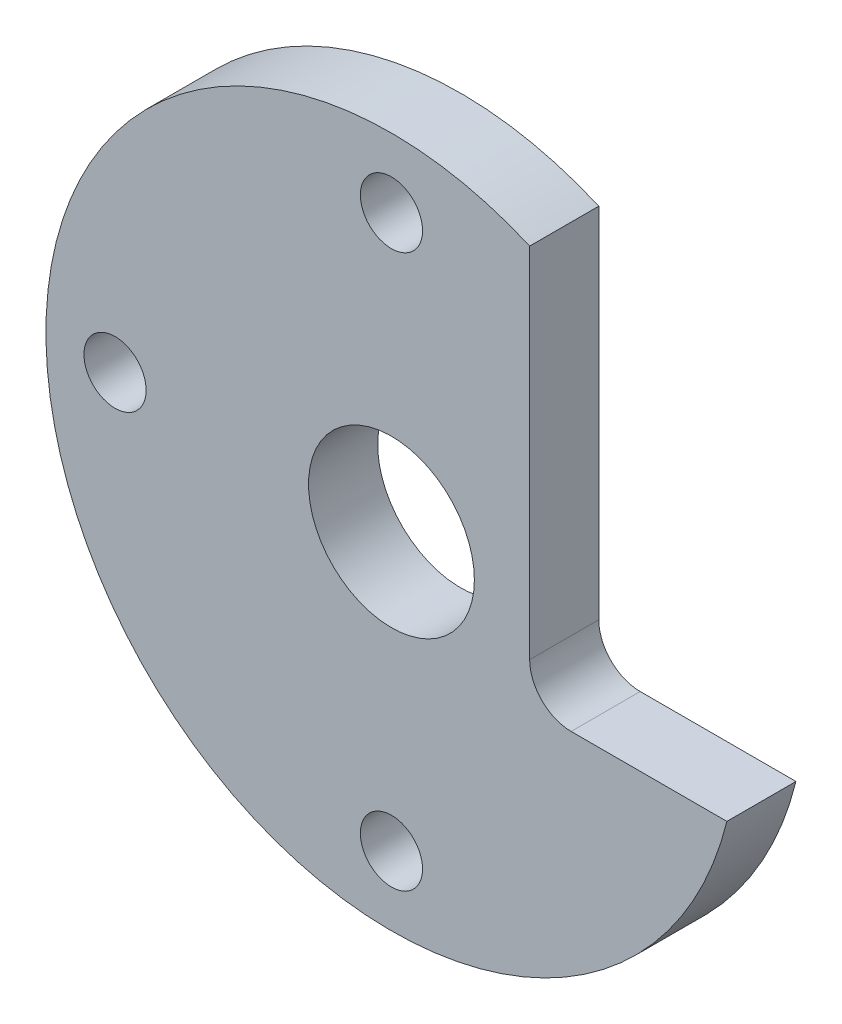
ISO-10303-21;
HEADER;
FILE_DESCRIPTION(('STEP AP214'),'2;1');
FILE_NAME('part.step','',(''),(''),'','','');
FILE_SCHEMA(('AUTOMOTIVE_DESIGN { 1 0 10303 214 1 1 1 1 }'));
ENDSEC;
DATA;
#1=APPLICATION_CONTEXT('core data for automotive mechanical design processes');
#2=APPLICATION_PROTOCOL_DEFINITION('international standard','automotive_design',2000,#1);
#3=PRODUCT_CONTEXT('',#1,'mechanical');
#4=PRODUCT('Part','Part','',(#3));
#5=PRODUCT_RELATED_PRODUCT_CATEGORY('part','',(#4));
#6=PRODUCT_DEFINITION_FORMATION('','',#4);
#7=PRODUCT_DEFINITION_CONTEXT('part definition',#1,'design');
#8=PRODUCT_DEFINITION('design','',#6,#7);
#9=PRODUCT_DEFINITION_SHAPE('','',#8);
#10=(LENGTH_UNIT() NAMED_UNIT(*) SI_UNIT(.MILLI.,.METRE.));
#11=(NAMED_UNIT(*) PLANE_ANGLE_UNIT() SI_UNIT($,.RADIAN.));
#12=(NAMED_UNIT(*) SI_UNIT($,.STERADIAN.) SOLID_ANGLE_UNIT());
#13=UNCERTAINTY_MEASURE_WITH_UNIT(LENGTH_MEASURE(1.E-05),#10,'distance_accuracy_value','');
#14=(GEOMETRIC_REPRESENTATION_CONTEXT(3) GLOBAL_UNCERTAINTY_ASSIGNED_CONTEXT((#13)) GLOBAL_UNIT_ASSIGNED_CONTEXT((#10,
#11,#12)) REPRESENTATION_CONTEXT('',''));
#15=CARTESIAN_POINT('',(0.,0.,0.));
#16=DIRECTION('',(0.,0.,1.));
#17=DIRECTION('',(1.,0.,0.));
#18=AXIS2_PLACEMENT_3D('',#15,#16,#17);
#19=CARTESIAN_POINT('',(0.,0.,5.));
#20=DIRECTION('',(0.,0.,1.));
#21=DIRECTION('',(1.,0.,0.));
#22=AXIS2_PLACEMENT_3D('',#19,#20,#21);
#23=PLANE('',#22);
#24=DIRECTION('',(-1.,0.,0.));
#25=VECTOR('',#24,1.);
#26=CARTESIAN_POINT('',(10.,-6.,5.));
#27=LINE('',#26,#25);
#28=CARTESIAN_POINT('',(24.2693221990232,-6.,5.));
#29=VERTEX_POINT('',#28);
#30=CARTESIAN_POINT('',(13.,-6.,5.));
#31=VERTEX_POINT('',#30);
#32=EDGE_CURVE('E75',#29,#31,#27,.T.);
#33=ORIENTED_EDGE('',*,*,#32,.T.);
#34=CARTESIAN_POINT('',(13.,-3.,5.));
#35=DIRECTION('',(0.,0.,1.));
#36=DIRECTION('',(1.,0.,0.));
#37=AXIS2_PLACEMENT_3D('',#34,#35,#36);
#38=CIRCLE('',#37,3.);
#39=CARTESIAN_POINT('',(10.,-3.,5.));
#40=VERTEX_POINT('',#39);
#41=EDGE_CURVE('E11',#31,#40,#38,.F.);
#42=ORIENTED_EDGE('',*,*,#41,.T.);
#43=DIRECTION('',(0.,1.,0.));
#44=VECTOR('',#43,1.);
#45=CARTESIAN_POINT('',(10.,33.3511979168591,5.));
#46=LINE('',#45,#44);
#47=CARTESIAN_POINT('',(10.,22.9128784747792,5.));
#48=VERTEX_POINT('',#47);
#49=EDGE_CURVE('E108',#40,#48,#46,.T.);
#50=ORIENTED_EDGE('',*,*,#49,.T.);
#51=CARTESIAN_POINT('',(0.,0.,5.));
#52=DIRECTION('',(0.,0.,1.));
#53=DIRECTION('',(1.,0.,0.));
#54=AXIS2_PLACEMENT_3D('',#51,#52,#53);
#55=CIRCLE('',#54,25.);
#56=EDGE_CURVE('E81',#48,#29,#55,.T.);
#57=ORIENTED_EDGE('',*,*,#56,.T.);
#58=EDGE_LOOP('',(#33,#42,#50,#57));
#59=FACE_BOUND('',#58,.T.);
#60=CARTESIAN_POINT('',(-20.,0.,5.));
#61=DIRECTION('',(0.,0.,1.));
#62=DIRECTION('',(1.,0.,0.));
#63=AXIS2_PLACEMENT_3D('',#60,#61,#62);
#64=CIRCLE('',#63,2.25);
#65=CARTESIAN_POINT('',(-17.75,0.,5.));
#66=VERTEX_POINT('',#65);
#67=EDGE_CURVE('E122',#66,#66,#64,.T.);
#68=ORIENTED_EDGE('',*,*,#67,.F.);
#69=EDGE_LOOP('',(#68));
#70=FACE_BOUND('',#69,.T.);
#71=CARTESIAN_POINT('',(0.,0.,5.));
#72=DIRECTION('',(0.,0.,1.));
#73=DIRECTION('',(1.,0.,0.));
#74=AXIS2_PLACEMENT_3D('',#71,#72,#73);
#75=CIRCLE('',#74,6.);
#76=CARTESIAN_POINT('',(6.,0.,5.));
#77=VERTEX_POINT('',#76);
#78=EDGE_CURVE('E92',#77,#77,#75,.T.);
#79=ORIENTED_EDGE('',*,*,#78,.F.);
#80=EDGE_LOOP('',(#79));
#81=FACE_BOUND('',#80,.T.);
#82=CARTESIAN_POINT('',(0.,20.,5.));
#83=DIRECTION('',(0.,0.,1.));
#84=DIRECTION('',(1.,0.,0.));
#85=AXIS2_PLACEMENT_3D('',#82,#83,#84);
#86=CIRCLE('',#85,2.25);
#87=CARTESIAN_POINT('',(2.25,20.,5.));
#88=VERTEX_POINT('',#87);
#89=EDGE_CURVE('E128',#88,#88,#86,.T.);
#90=ORIENTED_EDGE('',*,*,#89,.F.);
#91=EDGE_LOOP('',(#90));
#92=FACE_BOUND('',#91,.T.);
#93=CARTESIAN_POINT('',(0.,-20.,5.));
#94=DIRECTION('',(0.,0.,1.));
#95=DIRECTION('',(1.,0.,0.));
#96=AXIS2_PLACEMENT_3D('',#93,#94,#95);
#97=CIRCLE('',#96,2.25);
#98=CARTESIAN_POINT('',(2.25,-20.,5.));
#99=VERTEX_POINT('',#98);
#100=EDGE_CURVE('E115',#99,#99,#97,.T.);
#101=ORIENTED_EDGE('',*,*,#100,.F.);
#102=EDGE_LOOP('',(#101));
#103=FACE_BOUND('',#102,.T.);
#104=ADVANCED_FACE('F34',(#59,#70,#81,#92,#103),#23,.T.);
#105=CARTESIAN_POINT('',(0.,0.,0.));
#106=DIRECTION('',(0.,0.,1.));
#107=DIRECTION('',(1.,0.,0.));
#108=AXIS2_PLACEMENT_3D('',#105,#106,#107);
#109=PLANE('',#108);
#110=CARTESIAN_POINT('',(0.,0.,0.));
#111=DIRECTION('',(0.,0.,1.));
#112=DIRECTION('',(1.,0.,0.));
#113=AXIS2_PLACEMENT_3D('',#110,#111,#112);
#114=CIRCLE('',#113,25.);
#115=CARTESIAN_POINT('',(10.,22.9128784747792,0.));
#116=VERTEX_POINT('',#115);
#117=CARTESIAN_POINT('',(24.2693221990232,-6.,0.));
#118=VERTEX_POINT('',#117);
#119=EDGE_CURVE('E86',#116,#118,#114,.T.);
#120=ORIENTED_EDGE('',*,*,#119,.F.);
#121=DIRECTION('',(0.,1.,0.));
#122=VECTOR('',#121,1.);
#123=CARTESIAN_POINT('',(10.,33.3511979168591,0.));
#124=LINE('',#123,#122);
#125=CARTESIAN_POINT('',(10.,-3.,0.));
#126=VERTEX_POINT('',#125);
#127=EDGE_CURVE('E87',#126,#116,#124,.T.);
#128=ORIENTED_EDGE('',*,*,#127,.F.);
#129=CARTESIAN_POINT('',(13.,-3.,0.));
#130=DIRECTION('',(0.,0.,1.));
#131=DIRECTION('',(1.,0.,0.));
#132=AXIS2_PLACEMENT_3D('',#129,#130,#131);
#133=CIRCLE('',#132,3.);
#134=CARTESIAN_POINT('',(13.,-6.,0.));
#135=VERTEX_POINT('',#134);
#136=EDGE_CURVE('E42',#126,#135,#133,.T.);
#137=ORIENTED_EDGE('',*,*,#136,.T.);
#138=DIRECTION('',(-1.,0.,0.));
#139=VECTOR('',#138,1.);
#140=CARTESIAN_POINT('',(10.,-6.,0.));
#141=LINE('',#140,#139);
#142=EDGE_CURVE('E74',#118,#135,#141,.T.);
#143=ORIENTED_EDGE('',*,*,#142,.F.);
#144=EDGE_LOOP('',(#120,#128,#137,#143));
#145=FACE_BOUND('',#144,.T.);
#146=CARTESIAN_POINT('',(0.,0.,0.));
#147=DIRECTION('',(0.,0.,1.));
#148=DIRECTION('',(1.,0.,0.));
#149=AXIS2_PLACEMENT_3D('',#146,#147,#148);
#150=CIRCLE('',#149,6.);
#151=CARTESIAN_POINT('',(6.,0.,0.));
#152=VERTEX_POINT('',#151);
#153=EDGE_CURVE('E96',#152,#152,#150,.T.);
#154=ORIENTED_EDGE('',*,*,#153,.T.);
#155=EDGE_LOOP('',(#154));
#156=FACE_BOUND('',#155,.T.);
#157=CARTESIAN_POINT('',(0.,20.,0.));
#158=DIRECTION('',(0.,0.,1.));
#159=DIRECTION('',(1.,0.,0.));
#160=AXIS2_PLACEMENT_3D('',#157,#158,#159);
#161=CIRCLE('',#160,2.25);
#162=CARTESIAN_POINT('',(2.25,20.,0.));
#163=VERTEX_POINT('',#162);
#164=EDGE_CURVE('E125',#163,#163,#161,.T.);
#165=ORIENTED_EDGE('',*,*,#164,.T.);
#166=EDGE_LOOP('',(#165));
#167=FACE_BOUND('',#166,.T.);
#168=CARTESIAN_POINT('',(-20.,0.,0.));
#169=DIRECTION('',(0.,0.,1.));
#170=DIRECTION('',(1.,0.,0.));
#171=AXIS2_PLACEMENT_3D('',#168,#169,#170);
#172=CIRCLE('',#171,2.25);
#173=CARTESIAN_POINT('',(-17.75,0.,0.));
#174=VERTEX_POINT('',#173);
#175=EDGE_CURVE('E118',#174,#174,#172,.T.);
#176=ORIENTED_EDGE('',*,*,#175,.T.);
#177=EDGE_LOOP('',(#176));
#178=FACE_BOUND('',#177,.T.);
#179=CARTESIAN_POINT('',(0.,-20.,0.));
#180=DIRECTION('',(0.,0.,1.));
#181=DIRECTION('',(1.,0.,0.));
#182=AXIS2_PLACEMENT_3D('',#179,#180,#181);
#183=CIRCLE('',#182,2.25);
#184=CARTESIAN_POINT('',(2.25,-20.,0.));
#185=VERTEX_POINT('',#184);
#186=EDGE_CURVE('E119',#185,#185,#183,.T.);
#187=ORIENTED_EDGE('',*,*,#186,.T.);
#188=EDGE_LOOP('',(#187));
#189=FACE_BOUND('',#188,.T.);
#190=ADVANCED_FACE('F84',(#145,#156,#167,#178,#189),#109,.F.);
#191=CARTESIAN_POINT('',(0.,0.,5.));
#192=DIRECTION('',(0.,0.,-1.));
#193=DIRECTION('',(-1.,0.,0.));
#194=AXIS2_PLACEMENT_3D('',#191,#192,#193);
#195=CYLINDRICAL_SURFACE('',#194,25.);
#196=ORIENTED_EDGE('',*,*,#56,.F.);
#197=DIRECTION('',(0.,0.,-1.));
#198=VECTOR('',#197,1.);
#199=CARTESIAN_POINT('',(10.,22.9128784747792,5.));
#200=LINE('',#199,#198);
#201=EDGE_CURVE('E80',#48,#116,#200,.T.);
#202=ORIENTED_EDGE('',*,*,#201,.T.);
#203=ORIENTED_EDGE('',*,*,#119,.T.);
#204=DIRECTION('',(0.,0.,-1.));
#205=VECTOR('',#204,1.);
#206=CARTESIAN_POINT('',(24.2693221990232,-6.,5.));
#207=LINE('',#206,#205);
#208=EDGE_CURVE('E72',#118,#29,#207,.F.);
#209=ORIENTED_EDGE('',*,*,#208,.T.);
#210=EDGE_LOOP('',(#196,#202,#203,#209));
#211=FACE_BOUND('',#210,.T.);
#212=ADVANCED_FACE('F90',(#211),#195,.T.);
#213=CARTESIAN_POINT('',(0.,0.,5.));
#214=DIRECTION('',(0.,0.,-1.));
#215=DIRECTION('',(-1.,0.,0.));
#216=AXIS2_PLACEMENT_3D('',#213,#214,#215);
#217=CYLINDRICAL_SURFACE('',#216,6.);
#218=ORIENTED_EDGE('',*,*,#78,.T.);
#219=EDGE_LOOP('',(#218));
#220=FACE_BOUND('',#219,.T.);
#221=ORIENTED_EDGE('',*,*,#153,.F.);
#222=EDGE_LOOP('',(#221));
#223=FACE_BOUND('',#222,.T.);
#224=ADVANCED_FACE('F136',(#220,#223),#217,.F.);
#225=CARTESIAN_POINT('',(0.,20.,5.));
#226=DIRECTION('',(0.,0.,-1.));
#227=DIRECTION('',(-1.,0.,0.));
#228=AXIS2_PLACEMENT_3D('',#225,#226,#227);
#229=CYLINDRICAL_SURFACE('',#228,2.25);
#230=ORIENTED_EDGE('',*,*,#89,.T.);
#231=EDGE_LOOP('',(#230));
#232=FACE_BOUND('',#231,.T.);
#233=ORIENTED_EDGE('',*,*,#164,.F.);
#234=EDGE_LOOP('',(#233));
#235=FACE_BOUND('',#234,.T.);
#236=ADVANCED_FACE('F138',(#232,#235),#229,.F.);
#237=CARTESIAN_POINT('',(-20.,0.,5.));
#238=DIRECTION('',(0.,0.,-1.));
#239=DIRECTION('',(-1.,0.,0.));
#240=AXIS2_PLACEMENT_3D('',#237,#238,#239);
#241=CYLINDRICAL_SURFACE('',#240,2.25);
#242=ORIENTED_EDGE('',*,*,#67,.T.);
#243=EDGE_LOOP('',(#242));
#244=FACE_BOUND('',#243,.T.);
#245=ORIENTED_EDGE('',*,*,#175,.F.);
#246=EDGE_LOOP('',(#245));
#247=FACE_BOUND('',#246,.T.);
#248=ADVANCED_FACE('F145',(#244,#247),#241,.F.);
#249=CARTESIAN_POINT('',(0.,-20.,5.));
#250=DIRECTION('',(0.,0.,-1.));
#251=DIRECTION('',(-1.,0.,0.));
#252=AXIS2_PLACEMENT_3D('',#249,#250,#251);
#253=CYLINDRICAL_SURFACE('',#252,2.25);
#254=ORIENTED_EDGE('',*,*,#100,.T.);
#255=EDGE_LOOP('',(#254));
#256=FACE_BOUND('',#255,.T.);
#257=ORIENTED_EDGE('',*,*,#186,.F.);
#258=EDGE_LOOP('',(#257));
#259=FACE_BOUND('',#258,.T.);
#260=ADVANCED_FACE('F164',(#256,#259),#253,.F.);
#261=CARTESIAN_POINT('',(10.,33.3511979168591,5.));
#262=DIRECTION('',(-1.,0.,0.));
#263=DIRECTION('',(0.,-1.,0.));
#264=AXIS2_PLACEMENT_3D('',#261,#262,#263);
#265=PLANE('',#264);
#266=ORIENTED_EDGE('',*,*,#49,.F.);
#267=DIRECTION('',(0.,0.,-1.));
#268=VECTOR('',#267,1.);
#269=CARTESIAN_POINT('',(10.,-3.,0.));
#270=LINE('',#269,#268);
#271=EDGE_CURVE('E101',#40,#126,#270,.T.);
#272=ORIENTED_EDGE('',*,*,#271,.T.);
#273=ORIENTED_EDGE('',*,*,#127,.T.);
#274=ORIENTED_EDGE('',*,*,#201,.F.);
#275=EDGE_LOOP('',(#266,#272,#273,#274));
#276=FACE_BOUND('',#275,.T.);
#277=ADVANCED_FACE('F107',(#276),#265,.F.);
#278=CARTESIAN_POINT('',(10.,-6.,5.));
#279=DIRECTION('',(0.,-1.,0.));
#280=DIRECTION('',(1.,0.,0.));
#281=AXIS2_PLACEMENT_3D('',#278,#279,#280);
#282=PLANE('',#281);
#283=ORIENTED_EDGE('',*,*,#142,.T.);
#284=DIRECTION('',(0.,0.,-1.));
#285=VECTOR('',#284,1.);
#286=CARTESIAN_POINT('',(13.,-6.,5.));
#287=LINE('',#286,#285);
#288=EDGE_CURVE('E49',#135,#31,#287,.F.);
#289=ORIENTED_EDGE('',*,*,#288,.T.);
#290=ORIENTED_EDGE('',*,*,#32,.F.);
#291=ORIENTED_EDGE('',*,*,#208,.F.);
#292=EDGE_LOOP('',(#283,#289,#290,#291));
#293=FACE_BOUND('',#292,.T.);
#294=ADVANCED_FACE('F73',(#293),#282,.F.);
#295=CARTESIAN_POINT('',(13.,-3.,5.));
#296=DIRECTION('',(0.,0.,1.));
#297=DIRECTION('',(1.,0.,0.));
#298=AXIS2_PLACEMENT_3D('',#295,#296,#297);
#299=CYLINDRICAL_SURFACE('',#298,3.);
#300=ORIENTED_EDGE('',*,*,#41,.F.);
#301=ORIENTED_EDGE('',*,*,#288,.F.);
#302=ORIENTED_EDGE('',*,*,#136,.F.);
#303=ORIENTED_EDGE('',*,*,#271,.F.);
#304=EDGE_LOOP('',(#300,#301,#302,#303));
#305=FACE_BOUND('',#304,.T.);
#306=ADVANCED_FACE('F36',(#305),#299,.F.);
#307=CLOSED_SHELL('',(#104,#190,#212,#224,#236,#248,#260,#277,#294,#306));
#308=MANIFOLD_SOLID_BREP('B2',#307);
#309=ADVANCED_BREP_SHAPE_REPRESENTATION('',(#18,#308),#14);
#310=SHAPE_DEFINITION_REPRESENTATION(#9,#309);
ENDSEC;
END-ISO-10303-21;
